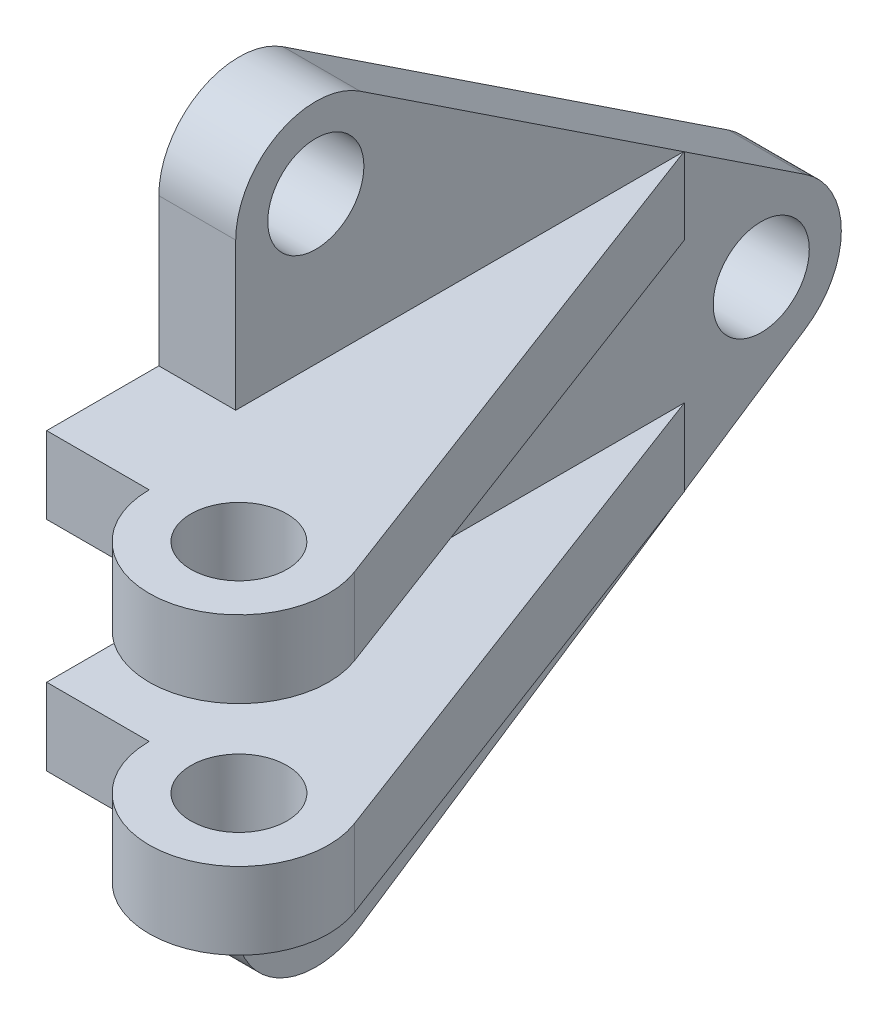
ISO-10303-21;
HEADER;
FILE_DESCRIPTION(('STEP AP214'),'2;1');
FILE_NAME('part.step','',(''),(''),'','','');
FILE_SCHEMA(('AUTOMOTIVE_DESIGN { 1 0 10303 214 1 1 1 1 }'));
ENDSEC;
DATA;
#1=APPLICATION_CONTEXT('core data for automotive mechanical design processes');
#2=APPLICATION_PROTOCOL_DEFINITION('international standard','automotive_design',2000,#1);
#3=PRODUCT_CONTEXT('',#1,'mechanical');
#4=PRODUCT('Part','Part','',(#3));
#5=PRODUCT_RELATED_PRODUCT_CATEGORY('part','',(#4));
#6=PRODUCT_DEFINITION_FORMATION('','',#4);
#7=PRODUCT_DEFINITION_CONTEXT('part definition',#1,'design');
#8=PRODUCT_DEFINITION('design','',#6,#7);
#9=PRODUCT_DEFINITION_SHAPE('','',#8);
#10=(LENGTH_UNIT() NAMED_UNIT(*) SI_UNIT(.MILLI.,.METRE.));
#11=(NAMED_UNIT(*) PLANE_ANGLE_UNIT() SI_UNIT($,.RADIAN.));
#12=(NAMED_UNIT(*) SI_UNIT($,.STERADIAN.) SOLID_ANGLE_UNIT());
#13=UNCERTAINTY_MEASURE_WITH_UNIT(LENGTH_MEASURE(1.E-05),#10,'distance_accuracy_value','');
#14=(GEOMETRIC_REPRESENTATION_CONTEXT(3) GLOBAL_UNCERTAINTY_ASSIGNED_CONTEXT((#13)) GLOBAL_UNIT_ASSIGNED_CONTEXT((#10,
#11,#12)) REPRESENTATION_CONTEXT('',''));
#15=CARTESIAN_POINT('',(0.,0.,0.));
#16=DIRECTION('',(0.,0.,1.));
#17=DIRECTION('',(1.,0.,0.));
#18=AXIS2_PLACEMENT_3D('',#15,#16,#17);
#19=CARTESIAN_POINT('',(31.1013171350298,-23.,94.564871903651));
#20=DIRECTION('',(0.935808366787846,0.,-0.352509149739214));
#21=DIRECTION('',(-0.352509149739214,0.,-0.935808366787846));
#22=AXIS2_PLACEMENT_3D('',#19,#20,#21);
#23=PLANE('',#22);
#24=DIRECTION('',(0.,-1.,0.));
#25=VECTOR('',#24,1.);
#26=CARTESIAN_POINT('',(0.,-46.,12.));
#27=LINE('',#26,#25);
#28=CARTESIAN_POINT('',(0.,-11.,12.));
#29=VERTEX_POINT('',#28);
#30=CARTESIAN_POINT('',(0.,-22.9324039501064,12.));
#31=VERTEX_POINT('',#30);
#32=EDGE_CURVE('E205',#29,#31,#27,.T.);
#33=ORIENTED_EDGE('',*,*,#32,.F.);
#34=DIRECTION('',(-0.352509149739214,0.,-0.935808366787846));
#35=VECTOR('',#34,1.);
#36=CARTESIAN_POINT('',(31.1013171350298,-11.,94.564871903651));
#37=LINE('',#36,#35);
#38=CARTESIAN_POINT('',(31.1013171350299,-11.,94.564871903651));
#39=VERTEX_POINT('',#38);
#40=EDGE_CURVE('E394',#39,#29,#37,.T.);
#41=ORIENTED_EDGE('',*,*,#40,.F.);
#42=DIRECTION('',(0.,1.,0.));
#43=VECTOR('',#42,1.);
#44=CARTESIAN_POINT('',(31.1013171350299,-23.,94.564871903651));
#45=LINE('',#44,#43);
#46=CARTESIAN_POINT('',(31.1013171350299,-23.,94.564871903651));
#47=VERTEX_POINT('',#46);
#48=EDGE_CURVE('E402',#47,#39,#45,.T.);
#49=ORIENTED_EDGE('',*,*,#48,.F.);
#50=DIRECTION('',(-0.352509149739214,0.,-0.935808366787846));
#51=VECTOR('',#50,1.);
#52=CARTESIAN_POINT('',(31.1013171350298,-23.,94.564871903651));
#53=LINE('',#52,#51);
#54=CARTESIAN_POINT('',(0.,-23.,12.));
#55=VERTEX_POINT('',#54);
#56=EDGE_CURVE('E363',#47,#55,#53,.T.);
#57=ORIENTED_EDGE('',*,*,#56,.T.);
#58=DIRECTION('',(0.,1.,0.));
#59=VECTOR('',#58,1.);
#60=CARTESIAN_POINT('',(0.,-23.,12.));
#61=LINE('',#60,#59);
#62=EDGE_CURVE('E362',#55,#31,#61,.T.);
#63=ORIENTED_EDGE('',*,*,#62,.T.);
#64=EDGE_LOOP('',(#33,#41,#49,#57,#63));
#65=FACE_BOUND('',#64,.T.);
#66=ADVANCED_FACE('F39',(#65),#23,.T.);
#67=CARTESIAN_POINT('',(18.,-23.,99.5));
#68=DIRECTION('',(0.,1.,0.));
#69=DIRECTION('',(0.,0.,1.));
#70=AXIS2_PLACEMENT_3D('',#67,#68,#69);
#71=CYLINDRICAL_SURFACE('',#70,14.);
#72=DIRECTION('',(0.,1.,0.));
#73=VECTOR('',#72,1.);
#74=CARTESIAN_POINT('',(4.,-23.,99.5));
#75=LINE('',#74,#73);
#76=CARTESIAN_POINT('',(4.,11.,99.5));
#77=VERTEX_POINT('',#76);
#78=CARTESIAN_POINT('',(4.,23.,99.5));
#79=VERTEX_POINT('',#78);
#80=EDGE_CURVE('E410',#77,#79,#75,.T.);
#81=ORIENTED_EDGE('',*,*,#80,.F.);
#82=CARTESIAN_POINT('',(18.,11.,99.5));
#83=DIRECTION('',(0.,1.,0.));
#84=DIRECTION('',(0.,0.,1.));
#85=AXIS2_PLACEMENT_3D('',#82,#83,#84);
#86=CIRCLE('',#85,14.);
#87=CARTESIAN_POINT('',(31.1013171350299,11.,94.564871903651));
#88=VERTEX_POINT('',#87);
#89=EDGE_CURVE('E187',#88,#77,#86,.F.);
#90=ORIENTED_EDGE('',*,*,#89,.F.);
#91=CARTESIAN_POINT('',(31.1013171350299,23.,94.564871903651));
#92=VERTEX_POINT('',#91);
#93=EDGE_CURVE('E183',#88,#92,#45,.T.);
#94=ORIENTED_EDGE('',*,*,#93,.T.);
#95=CARTESIAN_POINT('',(18.,23.,99.5));
#96=DIRECTION('',(0.,1.,0.));
#97=DIRECTION('',(0.,0.,1.));
#98=AXIS2_PLACEMENT_3D('',#95,#96,#97);
#99=CIRCLE('',#98,14.);
#100=EDGE_CURVE('E456',#79,#92,#99,.T.);
#101=ORIENTED_EDGE('',*,*,#100,.F.);
#102=EDGE_LOOP('',(#81,#90,#94,#101));
#103=FACE_BOUND('',#102,.T.);
#104=ADVANCED_FACE('F232',(#103),#71,.T.);
#105=CARTESIAN_POINT('',(18.,-23.,99.5));
#106=DIRECTION('',(0.,1.,0.));
#107=DIRECTION('',(0.,0.,1.));
#108=AXIS2_PLACEMENT_3D('',#105,#106,#107);
#109=CYLINDRICAL_SURFACE('',#108,7.5);
#110=CARTESIAN_POINT('',(18.,23.,99.5));
#111=DIRECTION('',(0.,1.,0.));
#112=DIRECTION('',(0.,0.,1.));
#113=AXIS2_PLACEMENT_3D('',#110,#111,#112);
#114=CIRCLE('',#113,7.5);
#115=CARTESIAN_POINT('',(18.,23.,107.));
#116=VERTEX_POINT('',#115);
#117=EDGE_CURVE('E186',#116,#116,#114,.T.);
#118=ORIENTED_EDGE('',*,*,#117,.T.);
#119=EDGE_LOOP('',(#118));
#120=FACE_BOUND('',#119,.T.);
#121=CARTESIAN_POINT('',(18.,11.,99.5));
#122=DIRECTION('',(0.,1.,0.));
#123=DIRECTION('',(0.,0.,1.));
#124=AXIS2_PLACEMENT_3D('',#121,#122,#123);
#125=CIRCLE('',#124,7.5);
#126=CARTESIAN_POINT('',(18.,11.,107.));
#127=VERTEX_POINT('',#126);
#128=EDGE_CURVE('E47',#127,#127,#125,.F.);
#129=ORIENTED_EDGE('',*,*,#128,.T.);
#130=EDGE_LOOP('',(#129));
#131=FACE_BOUND('',#130,.T.);
#132=ADVANCED_FACE('F215',(#120,#131),#109,.F.);
#133=CARTESIAN_POINT('',(-12.,-23.,99.5));
#134=DIRECTION('',(0.,0.,1.));
#135=DIRECTION('',(1.,0.,0.));
#136=AXIS2_PLACEMENT_3D('',#133,#134,#135);
#137=PLANE('',#136);
#138=DIRECTION('',(-1.,0.,0.));
#139=VECTOR('',#138,1.);
#140=CARTESIAN_POINT('',(-12.,11.,99.5));
#141=LINE('',#140,#139);
#142=CARTESIAN_POINT('',(-12.,11.,99.5));
#143=VERTEX_POINT('',#142);
#144=EDGE_CURVE('E483',#77,#143,#141,.T.);
#145=ORIENTED_EDGE('',*,*,#144,.F.);
#146=ORIENTED_EDGE('',*,*,#80,.T.);
#147=DIRECTION('',(1.,0.,0.));
#148=VECTOR('',#147,1.);
#149=CARTESIAN_POINT('',(-12.,23.,99.5));
#150=LINE('',#149,#148);
#151=CARTESIAN_POINT('',(-12.,23.,99.5));
#152=VERTEX_POINT('',#151);
#153=EDGE_CURVE('E461',#152,#79,#150,.T.);
#154=ORIENTED_EDGE('',*,*,#153,.F.);
#155=DIRECTION('',(0.,1.,0.));
#156=VECTOR('',#155,1.);
#157=CARTESIAN_POINT('',(-12.,-23.,99.5));
#158=LINE('',#157,#156);
#159=EDGE_CURVE('E298',#143,#152,#158,.T.);
#160=ORIENTED_EDGE('',*,*,#159,.F.);
#161=EDGE_LOOP('',(#145,#146,#154,#160));
#162=FACE_BOUND('',#161,.T.);
#163=ADVANCED_FACE('F272',(#162),#137,.T.);
#164=CARTESIAN_POINT('',(-12.,-46.,82.));
#165=DIRECTION('',(0.,0.,1.));
#166=DIRECTION('',(1.,0.,0.));
#167=AXIS2_PLACEMENT_3D('',#164,#165,#166);
#168=PLANE('',#167);
#169=DIRECTION('',(0.,-1.,0.));
#170=VECTOR('',#169,1.);
#171=CARTESIAN_POINT('',(0.,-46.,82.));
#172=LINE('',#171,#170);
#173=CARTESIAN_POINT('',(0.,-23.,82.));
#174=VERTEX_POINT('',#173);
#175=CARTESIAN_POINT('',(0.,-46.,82.));
#176=VERTEX_POINT('',#175);
#177=EDGE_CURVE('E297',#174,#176,#172,.T.);
#178=ORIENTED_EDGE('',*,*,#177,.F.);
#179=DIRECTION('',(-1.,0.,0.));
#180=VECTOR('',#179,1.);
#181=CARTESIAN_POINT('',(-12.,-23.,82.));
#182=LINE('',#181,#180);
#183=CARTESIAN_POINT('',(-12.,-23.,82.));
#184=VERTEX_POINT('',#183);
#185=EDGE_CURVE('E281',#174,#184,#182,.T.);
#186=ORIENTED_EDGE('',*,*,#185,.T.);
#187=DIRECTION('',(0.,-1.,0.));
#188=VECTOR('',#187,1.);
#189=CARTESIAN_POINT('',(-12.,-46.,82.));
#190=LINE('',#189,#188);
#191=CARTESIAN_POINT('',(-12.,-46.,82.));
#192=VERTEX_POINT('',#191);
#193=EDGE_CURVE('E295',#184,#192,#190,.T.);
#194=ORIENTED_EDGE('',*,*,#193,.T.);
#195=DIRECTION('',(1.,0.,0.));
#196=VECTOR('',#195,1.);
#197=CARTESIAN_POINT('',(-12.,-46.,82.));
#198=LINE('',#197,#196);
#199=EDGE_CURVE('E338',#192,#176,#198,.T.);
#200=ORIENTED_EDGE('',*,*,#199,.T.);
#201=EDGE_LOOP('',(#178,#186,#194,#200));
#202=FACE_BOUND('',#201,.T.);
#203=ADVANCED_FACE('F293',(#202),#168,.T.);
#204=CARTESIAN_POINT('',(0.,-46.,69.5));
#205=DIRECTION('',(-1.,0.,0.));
#206=DIRECTION('',(0.,0.,1.));
#207=AXIS2_PLACEMENT_3D('',#204,#205,#206);
#208=PLANE('',#207);
#209=CARTESIAN_POINT('',(0.,-46.,69.5));
#210=DIRECTION('',(1.,0.,0.));
#211=DIRECTION('',(0.,0.,1.));
#212=AXIS2_PLACEMENT_3D('',#209,#210,#211);
#213=CIRCLE('',#212,7.5);
#214=CARTESIAN_POINT('',(0.,-46.,77.));
#215=VERTEX_POINT('',#214);
#216=EDGE_CURVE('E396',#215,#215,#213,.T.);
#217=ORIENTED_EDGE('',*,*,#216,.F.);
#218=EDGE_LOOP('',(#217));
#219=FACE_BOUND('',#218,.T.);
#220=DIRECTION('',(0.,0.,-1.));
#221=VECTOR('',#220,1.);
#222=CARTESIAN_POINT('',(0.,-23.,69.5));
#223=LINE('',#222,#221);
#224=CARTESIAN_POINT('',(0.,-23.,12.1021288145132));
#225=VERTEX_POINT('',#224);
#226=EDGE_CURVE('E209',#174,#225,#223,.T.);
#227=ORIENTED_EDGE('',*,*,#226,.F.);
#228=ORIENTED_EDGE('',*,*,#177,.T.);
#229=CARTESIAN_POINT('',(0.,-46.,69.5));
#230=DIRECTION('',(1.,0.,0.));
#231=DIRECTION('',(0.,0.,1.));
#232=AXIS2_PLACEMENT_3D('',#229,#230,#231);
#233=CIRCLE('',#232,12.5);
#234=CARTESIAN_POINT('',(0.,-56.4236450142165,62.6008968251229));
#235=VERTEX_POINT('',#234);
#236=EDGE_CURVE('E318',#176,#235,#233,.T.);
#237=ORIENTED_EDGE('',*,*,#236,.T.);
#238=DIRECTION('',(0.,0.551928253990169,-0.83389160113732));
#239=VECTOR('',#238,1.);
#240=CARTESIAN_POINT('',(0.,-56.4236450142165,62.6008968251229));
#241=LINE('',#240,#239);
#242=EDGE_CURVE('E323',#235,#225,#241,.T.);
#243=ORIENTED_EDGE('',*,*,#242,.T.);
#244=EDGE_LOOP('',(#227,#228,#237,#243));
#245=FACE_BOUND('',#244,.T.);
#246=ADVANCED_FACE('F369',(#219,#245),#208,.F.);
#247=CARTESIAN_POINT('',(0.,22.9324039501064,12.));
#248=VERTEX_POINT('',#247);
#249=CARTESIAN_POINT('',(0.,11.,11.9999999999999));
#250=VERTEX_POINT('',#249);
#251=EDGE_CURVE('E180',#248,#250,#27,.T.);
#252=ORIENTED_EDGE('',*,*,#251,.T.);
#253=DIRECTION('',(0.,0.,1.));
#254=VECTOR('',#253,1.);
#255=CARTESIAN_POINT('',(0.,11.,-12.5));
#256=LINE('',#255,#254);
#257=CARTESIAN_POINT('',(0.,11.,82.));
#258=VERTEX_POINT('',#257);
#259=EDGE_CURVE('E190',#250,#258,#256,.T.);
#260=ORIENTED_EDGE('',*,*,#259,.T.);
#261=DIRECTION('',(0.,-1.,0.));
#262=VECTOR('',#261,1.);
#263=CARTESIAN_POINT('',(0.,-46.,82.));
#264=LINE('',#263,#262);
#265=CARTESIAN_POINT('',(0.,-11.,82.));
#266=VERTEX_POINT('',#265);
#267=EDGE_CURVE('E11',#258,#266,#264,.T.);
#268=ORIENTED_EDGE('',*,*,#267,.T.);
#269=DIRECTION('',(0.,0.,1.));
#270=VECTOR('',#269,1.);
#271=CARTESIAN_POINT('',(0.,-11.,-12.5));
#272=LINE('',#271,#270);
#273=EDGE_CURVE('E197',#29,#266,#272,.T.);
#274=ORIENTED_EDGE('',*,*,#273,.F.);
#275=ORIENTED_EDGE('',*,*,#32,.T.);
#276=CARTESIAN_POINT('',(0.,-10.4236450142165,-6.89910317487711));
#277=VERTEX_POINT('',#276);
#278=EDGE_CURVE('E321',#31,#277,#241,.T.);
#279=ORIENTED_EDGE('',*,*,#278,.T.);
#280=CARTESIAN_POINT('',(0.,0.,0.));
#281=DIRECTION('',(1.,0.,0.));
#282=DIRECTION('',(0.,0.,-1.));
#283=AXIS2_PLACEMENT_3D('',#280,#281,#282);
#284=CIRCLE('',#283,12.5);
#285=CARTESIAN_POINT('',(0.,10.4236450142165,-6.89910317487711));
#286=VERTEX_POINT('',#285);
#287=EDGE_CURVE('E326',#277,#286,#284,.T.);
#288=ORIENTED_EDGE('',*,*,#287,.T.);
#289=DIRECTION('',(0.,0.551928253990169,0.83389160113732));
#290=VECTOR('',#289,1.);
#291=CARTESIAN_POINT('',(0.,56.4236450142165,62.6008968251229));
#292=LINE('',#291,#290);
#293=EDGE_CURVE('E202',#286,#248,#292,.T.);
#294=ORIENTED_EDGE('',*,*,#293,.T.);
#295=EDGE_LOOP('',(#252,#260,#268,#274,#275,#279,#288,#294));
#296=FACE_BOUND('',#295,.T.);
#297=CARTESIAN_POINT('',(0.,0.,0.));
#298=DIRECTION('',(1.,0.,0.));
#299=DIRECTION('',(0.,0.,-1.));
#300=AXIS2_PLACEMENT_3D('',#297,#298,#299);
#301=CIRCLE('',#300,7.5);
#302=CARTESIAN_POINT('',(0.,0.,-7.5));
#303=VERTEX_POINT('',#302);
#304=EDGE_CURVE('E419',#303,#303,#301,.T.);
#305=ORIENTED_EDGE('',*,*,#304,.F.);
#306=EDGE_LOOP('',(#305));
#307=FACE_BOUND('',#306,.T.);
#308=ADVANCED_FACE('F199',(#296,#307),#208,.F.);
#309=CARTESIAN_POINT('',(-12.,-46.,69.5));
#310=DIRECTION('',(1.,0.,0.));
#311=DIRECTION('',(0.,0.,-1.));
#312=AXIS2_PLACEMENT_3D('',#309,#310,#311);
#313=CYLINDRICAL_SURFACE('',#312,12.5);
#314=ORIENTED_EDGE('',*,*,#236,.F.);
#315=ORIENTED_EDGE('',*,*,#199,.F.);
#316=CARTESIAN_POINT('',(-12.,-46.,69.5));
#317=DIRECTION('',(1.,0.,0.));
#318=DIRECTION('',(0.,0.,1.));
#319=AXIS2_PLACEMENT_3D('',#316,#317,#318);
#320=CIRCLE('',#319,12.5);
#321=CARTESIAN_POINT('',(-12.,-56.4236450142165,62.6008968251229));
#322=VERTEX_POINT('',#321);
#323=EDGE_CURVE('E307',#192,#322,#320,.T.);
#324=ORIENTED_EDGE('',*,*,#323,.T.);
#325=DIRECTION('',(1.,0.,0.));
#326=VECTOR('',#325,1.);
#327=CARTESIAN_POINT('',(-12.,-56.4236450142165,62.6008968251229));
#328=LINE('',#327,#326);
#329=EDGE_CURVE('E312',#322,#235,#328,.T.);
#330=ORIENTED_EDGE('',*,*,#329,.T.);
#331=EDGE_LOOP('',(#314,#315,#324,#330));
#332=FACE_BOUND('',#331,.T.);
#333=ADVANCED_FACE('F41',(#332),#313,.T.);
#334=DIRECTION('',(-1.,0.,0.));
#335=VECTOR('',#334,1.);
#336=CARTESIAN_POINT('',(-12.,23.,82.));
#337=LINE('',#336,#335);
#338=CARTESIAN_POINT('',(0.,23.,82.));
#339=VERTEX_POINT('',#338);
#340=CARTESIAN_POINT('',(-12.,23.,82.));
#341=VERTEX_POINT('',#340);
#342=EDGE_CURVE('E289',#339,#341,#337,.T.);
#343=ORIENTED_EDGE('',*,*,#342,.F.);
#344=CARTESIAN_POINT('',(0.,46.,82.));
#345=VERTEX_POINT('',#344);
#346=EDGE_CURVE('E335',#345,#339,#172,.T.);
#347=ORIENTED_EDGE('',*,*,#346,.F.);
#348=DIRECTION('',(1.,0.,0.));
#349=VECTOR('',#348,1.);
#350=CARTESIAN_POINT('',(-12.,46.,82.));
#351=LINE('',#350,#349);
#352=CARTESIAN_POINT('',(-12.,46.,82.));
#353=VERTEX_POINT('',#352);
#354=EDGE_CURVE('E341',#353,#345,#351,.T.);
#355=ORIENTED_EDGE('',*,*,#354,.F.);
#356=EDGE_CURVE('E308',#353,#341,#190,.T.);
#357=ORIENTED_EDGE('',*,*,#356,.T.);
#358=EDGE_LOOP('',(#343,#347,#355,#357));
#359=FACE_BOUND('',#358,.T.);
#360=ADVANCED_FACE('F434',(#359),#168,.T.);
#361=CARTESIAN_POINT('',(-12.,46.,69.5));
#362=DIRECTION('',(1.,0.,0.));
#363=DIRECTION('',(0.,0.,-1.));
#364=AXIS2_PLACEMENT_3D('',#361,#362,#363);
#365=CYLINDRICAL_SURFACE('',#364,12.5);
#366=CARTESIAN_POINT('',(0.,46.,69.5));
#367=DIRECTION('',(1.,0.,0.));
#368=DIRECTION('',(0.,0.,-1.));
#369=AXIS2_PLACEMENT_3D('',#366,#367,#368);
#370=CIRCLE('',#369,12.5);
#371=CARTESIAN_POINT('',(0.,56.4236450142165,62.6008968251229));
#372=VERTEX_POINT('',#371);
#373=EDGE_CURVE('E331',#372,#345,#370,.T.);
#374=ORIENTED_EDGE('',*,*,#373,.F.);
#375=DIRECTION('',(1.,0.,0.));
#376=VECTOR('',#375,1.);
#377=CARTESIAN_POINT('',(-12.,56.4236450142165,62.6008968251229));
#378=LINE('',#377,#376);
#379=CARTESIAN_POINT('',(-12.,56.4236450142165,62.6008968251229));
#380=VERTEX_POINT('',#379);
#381=EDGE_CURVE('E343',#380,#372,#378,.T.);
#382=ORIENTED_EDGE('',*,*,#381,.F.);
#383=CARTESIAN_POINT('',(-12.,46.,69.5));
#384=DIRECTION('',(1.,0.,0.));
#385=DIRECTION('',(0.,0.,-1.));
#386=AXIS2_PLACEMENT_3D('',#383,#384,#385);
#387=CIRCLE('',#386,12.5);
#388=EDGE_CURVE('E309',#380,#353,#387,.T.);
#389=ORIENTED_EDGE('',*,*,#388,.T.);
#390=ORIENTED_EDGE('',*,*,#354,.T.);
#391=EDGE_LOOP('',(#374,#382,#389,#390));
#392=FACE_BOUND('',#391,.T.);
#393=ADVANCED_FACE('F545',(#392),#365,.T.);
#394=CARTESIAN_POINT('',(-12.,56.4236450142165,62.6008968251229));
#395=DIRECTION('',(0.,0.83389160113732,-0.551928253990169));
#396=DIRECTION('',(0.,0.551928253990169,0.83389160113732));
#397=AXIS2_PLACEMENT_3D('',#394,#395,#396);
#398=PLANE('',#397);
#399=ORIENTED_EDGE('',*,*,#293,.F.);
#400=DIRECTION('',(1.,0.,0.));
#401=VECTOR('',#400,1.);
#402=CARTESIAN_POINT('',(-12.,10.4236450142165,-6.89910317487711));
#403=LINE('',#402,#401);
#404=CARTESIAN_POINT('',(-12.,10.4236450142165,-6.89910317487711));
#405=VERTEX_POINT('',#404);
#406=EDGE_CURVE('E346',#405,#286,#403,.T.);
#407=ORIENTED_EDGE('',*,*,#406,.F.);
#408=DIRECTION('',(0.,0.551928253990169,0.83389160113732));
#409=VECTOR('',#408,1.);
#410=CARTESIAN_POINT('',(-12.,56.4236450142165,62.6008968251229));
#411=LINE('',#410,#409);
#412=EDGE_CURVE('E314',#405,#380,#411,.T.);
#413=ORIENTED_EDGE('',*,*,#412,.T.);
#414=ORIENTED_EDGE('',*,*,#381,.T.);
#415=CARTESIAN_POINT('',(0.,23.,12.1021288145132));
#416=VERTEX_POINT('',#415);
#417=EDGE_CURVE('E329',#416,#372,#292,.T.);
#418=ORIENTED_EDGE('',*,*,#417,.F.);
#419=EDGE_CURVE('E332',#248,#416,#292,.T.);
#420=ORIENTED_EDGE('',*,*,#419,.F.);
#421=EDGE_LOOP('',(#399,#407,#413,#414,#418,#420));
#422=FACE_BOUND('',#421,.T.);
#423=ADVANCED_FACE('F384',(#422),#398,.T.);
#424=CARTESIAN_POINT('',(-12.,0.,0.));
#425=DIRECTION('',(1.,0.,0.));
#426=DIRECTION('',(0.,0.,-1.));
#427=AXIS2_PLACEMENT_3D('',#424,#425,#426);
#428=CYLINDRICAL_SURFACE('',#427,12.5);
#429=ORIENTED_EDGE('',*,*,#287,.F.);
#430=DIRECTION('',(1.,0.,0.));
#431=VECTOR('',#430,1.);
#432=CARTESIAN_POINT('',(-12.,-10.4236450142165,-6.89910317487711));
#433=LINE('',#432,#431);
#434=CARTESIAN_POINT('',(-12.,-10.4236450142165,-6.89910317487711));
#435=VERTEX_POINT('',#434);
#436=EDGE_CURVE('E349',#435,#277,#433,.T.);
#437=ORIENTED_EDGE('',*,*,#436,.F.);
#438=CARTESIAN_POINT('',(-12.,0.,0.));
#439=DIRECTION('',(1.,0.,0.));
#440=DIRECTION('',(0.,0.,-1.));
#441=AXIS2_PLACEMENT_3D('',#438,#439,#440);
#442=CIRCLE('',#441,12.5);
#443=EDGE_CURVE('E377',#435,#405,#442,.T.);
#444=ORIENTED_EDGE('',*,*,#443,.T.);
#445=ORIENTED_EDGE('',*,*,#406,.T.);
#446=EDGE_LOOP('',(#429,#437,#444,#445));
#447=FACE_BOUND('',#446,.T.);
#448=ADVANCED_FACE('F390',(#447),#428,.T.);
#449=CARTESIAN_POINT('',(-12.,-56.4236450142165,62.6008968251229));
#450=DIRECTION('',(0.,-0.83389160113732,-0.551928253990169));
#451=DIRECTION('',(0.,0.551928253990169,-0.83389160113732));
#452=AXIS2_PLACEMENT_3D('',#449,#450,#451);
#453=PLANE('',#452);
#454=ORIENTED_EDGE('',*,*,#242,.F.);
#455=ORIENTED_EDGE('',*,*,#329,.F.);
#456=DIRECTION('',(0.,0.551928253990169,-0.83389160113732));
#457=VECTOR('',#456,1.);
#458=CARTESIAN_POINT('',(-12.,-56.4236450142165,62.6008968251229));
#459=LINE('',#458,#457);
#460=EDGE_CURVE('E373',#322,#435,#459,.T.);
#461=ORIENTED_EDGE('',*,*,#460,.T.);
#462=ORIENTED_EDGE('',*,*,#436,.T.);
#463=ORIENTED_EDGE('',*,*,#278,.F.);
#464=EDGE_CURVE('E327',#225,#31,#241,.T.);
#465=ORIENTED_EDGE('',*,*,#464,.F.);
#466=EDGE_LOOP('',(#454,#455,#461,#462,#463,#465));
#467=FACE_BOUND('',#466,.T.);
#468=ADVANCED_FACE('F368',(#467),#453,.T.);
#469=CARTESIAN_POINT('',(-12.,-46.,69.5));
#470=DIRECTION('',(-1.,0.,0.));
#471=DIRECTION('',(0.,0.,1.));
#472=AXIS2_PLACEMENT_3D('',#469,#470,#471);
#473=PLANE('',#472);
#474=DIRECTION('',(0.,0.,1.));
#475=VECTOR('',#474,1.);
#476=CARTESIAN_POINT('',(-12.,11.,32.8065044950046));
#477=LINE('',#476,#475);
#478=CARTESIAN_POINT('',(-12.,11.,82.));
#479=VERTEX_POINT('',#478);
#480=EDGE_CURVE('E482',#479,#143,#477,.T.);
#481=ORIENTED_EDGE('',*,*,#480,.T.);
#482=ORIENTED_EDGE('',*,*,#159,.T.);
#483=DIRECTION('',(0.,0.,1.));
#484=VECTOR('',#483,1.);
#485=CARTESIAN_POINT('',(-12.,23.,99.5));
#486=LINE('',#485,#484);
#487=EDGE_CURVE('E464',#341,#152,#486,.T.);
#488=ORIENTED_EDGE('',*,*,#487,.F.);
#489=ORIENTED_EDGE('',*,*,#356,.F.);
#490=ORIENTED_EDGE('',*,*,#388,.F.);
#491=ORIENTED_EDGE('',*,*,#412,.F.);
#492=ORIENTED_EDGE('',*,*,#443,.F.);
#493=ORIENTED_EDGE('',*,*,#460,.F.);
#494=ORIENTED_EDGE('',*,*,#323,.F.);
#495=ORIENTED_EDGE('',*,*,#193,.F.);
#496=DIRECTION('',(0.,0.,1.));
#497=VECTOR('',#496,1.);
#498=CARTESIAN_POINT('',(-12.,-23.,99.5));
#499=LINE('',#498,#497);
#500=CARTESIAN_POINT('',(-12.,-23.,99.5));
#501=VERTEX_POINT('',#500);
#502=EDGE_CURVE('E279',#184,#501,#499,.T.);
#503=ORIENTED_EDGE('',*,*,#502,.T.);
#504=CARTESIAN_POINT('',(-12.,-11.,99.5));
#505=VERTEX_POINT('',#504);
#506=EDGE_CURVE('E411',#501,#505,#158,.T.);
#507=ORIENTED_EDGE('',*,*,#506,.T.);
#508=DIRECTION('',(0.,0.,1.));
#509=VECTOR('',#508,1.);
#510=CARTESIAN_POINT('',(-12.,-11.,32.8065044950046));
#511=LINE('',#510,#509);
#512=CARTESIAN_POINT('',(-12.,-11.,82.));
#513=VERTEX_POINT('',#512);
#514=EDGE_CURVE('E54',#513,#505,#511,.T.);
#515=ORIENTED_EDGE('',*,*,#514,.F.);
#516=DIRECTION('',(0.,1.,0.));
#517=VECTOR('',#516,1.);
#518=CARTESIAN_POINT('',(-12.,11.,82.));
#519=LINE('',#518,#517);
#520=EDGE_CURVE('E480',#513,#479,#519,.T.);
#521=ORIENTED_EDGE('',*,*,#520,.T.);
#522=EDGE_LOOP('',(#481,#482,#488,#489,#490,#491,#492,#493,#494,#495,#503,#507,#515,#521));
#523=FACE_BOUND('',#522,.T.);
#524=CARTESIAN_POINT('',(-12.,-46.,69.5));
#525=DIRECTION('',(1.,0.,0.));
#526=DIRECTION('',(0.,0.,1.));
#527=AXIS2_PLACEMENT_3D('',#524,#525,#526);
#528=CIRCLE('',#527,7.5);
#529=CARTESIAN_POINT('',(-12.,-46.,77.));
#530=VERTEX_POINT('',#529);
#531=EDGE_CURVE('E400',#530,#530,#528,.T.);
#532=ORIENTED_EDGE('',*,*,#531,.T.);
#533=EDGE_LOOP('',(#532));
#534=FACE_BOUND('',#533,.T.);
#535=CARTESIAN_POINT('',(-12.,46.,69.5));
#536=DIRECTION('',(1.,0.,0.));
#537=DIRECTION('',(0.,0.,-1.));
#538=AXIS2_PLACEMENT_3D('',#535,#536,#537);
#539=CIRCLE('',#538,7.5);
#540=CARTESIAN_POINT('',(-12.,46.,62.));
#541=VERTEX_POINT('',#540);
#542=EDGE_CURVE('E416',#541,#541,#539,.T.);
#543=ORIENTED_EDGE('',*,*,#542,.T.);
#544=EDGE_LOOP('',(#543));
#545=FACE_BOUND('',#544,.T.);
#546=CARTESIAN_POINT('',(-12.,0.,0.));
#547=DIRECTION('',(1.,0.,0.));
#548=DIRECTION('',(0.,0.,-1.));
#549=AXIS2_PLACEMENT_3D('',#546,#547,#548);
#550=CIRCLE('',#549,7.5);
#551=CARTESIAN_POINT('',(-12.,0.,-7.5));
#552=VERTEX_POINT('',#551);
#553=EDGE_CURVE('E322',#552,#552,#550,.T.);
#554=ORIENTED_EDGE('',*,*,#553,.T.);
#555=EDGE_LOOP('',(#554));
#556=FACE_BOUND('',#555,.T.);
#557=ADVANCED_FACE('F303',(#523,#534,#545,#556),#473,.T.);
#558=CARTESIAN_POINT('',(0.,46.,69.5));
#559=DIRECTION('',(1.,0.,0.));
#560=DIRECTION('',(0.,0.,-1.));
#561=AXIS2_PLACEMENT_3D('',#558,#559,#560);
#562=CIRCLE('',#561,7.5);
#563=CARTESIAN_POINT('',(0.,46.,62.));
#564=VERTEX_POINT('',#563);
#565=EDGE_CURVE('E414',#564,#564,#562,.T.);
#566=ORIENTED_EDGE('',*,*,#565,.F.);
#567=EDGE_LOOP('',(#566));
#568=FACE_BOUND('',#567,.T.);
#569=ORIENTED_EDGE('',*,*,#346,.T.);
#570=DIRECTION('',(0.,0.,-1.));
#571=VECTOR('',#570,1.);
#572=CARTESIAN_POINT('',(0.,23.,69.5));
#573=LINE('',#572,#571);
#574=EDGE_CURVE('E340',#339,#416,#573,.T.);
#575=ORIENTED_EDGE('',*,*,#574,.T.);
#576=ORIENTED_EDGE('',*,*,#417,.T.);
#577=ORIENTED_EDGE('',*,*,#373,.T.);
#578=EDGE_LOOP('',(#569,#575,#576,#577));
#579=FACE_BOUND('',#578,.T.);
#580=ADVANCED_FACE('F429',(#568,#579),#208,.F.);
#581=CARTESIAN_POINT('',(-12.,0.,0.));
#582=DIRECTION('',(1.,0.,0.));
#583=DIRECTION('',(0.,0.,-1.));
#584=AXIS2_PLACEMENT_3D('',#581,#582,#583);
#585=CYLINDRICAL_SURFACE('',#584,7.5);
#586=ORIENTED_EDGE('',*,*,#553,.F.);
#587=EDGE_LOOP('',(#586));
#588=FACE_BOUND('',#587,.T.);
#589=ORIENTED_EDGE('',*,*,#304,.T.);
#590=EDGE_LOOP('',(#589));
#591=FACE_BOUND('',#590,.T.);
#592=ADVANCED_FACE('F426',(#588,#591),#585,.F.);
#593=CARTESIAN_POINT('',(-12.,46.,69.5));
#594=DIRECTION('',(1.,0.,0.));
#595=DIRECTION('',(0.,0.,-1.));
#596=AXIS2_PLACEMENT_3D('',#593,#594,#595);
#597=CYLINDRICAL_SURFACE('',#596,7.5);
#598=ORIENTED_EDGE('',*,*,#542,.F.);
#599=EDGE_LOOP('',(#598));
#600=FACE_BOUND('',#599,.T.);
#601=ORIENTED_EDGE('',*,*,#565,.T.);
#602=EDGE_LOOP('',(#601));
#603=FACE_BOUND('',#602,.T.);
#604=ADVANCED_FACE('F445',(#600,#603),#597,.F.);
#605=CARTESIAN_POINT('',(-12.,-46.,69.5));
#606=DIRECTION('',(1.,0.,0.));
#607=DIRECTION('',(0.,0.,-1.));
#608=AXIS2_PLACEMENT_3D('',#605,#606,#607);
#609=CYLINDRICAL_SURFACE('',#608,7.5);
#610=ORIENTED_EDGE('',*,*,#531,.F.);
#611=EDGE_LOOP('',(#610));
#612=FACE_BOUND('',#611,.T.);
#613=ORIENTED_EDGE('',*,*,#216,.T.);
#614=EDGE_LOOP('',(#613));
#615=FACE_BOUND('',#614,.T.);
#616=ADVANCED_FACE('F259',(#612,#615),#609,.F.);
#617=CARTESIAN_POINT('',(0.,-23.,82.));
#618=DIRECTION('',(-1.,0.,0.));
#619=DIRECTION('',(0.,0.,1.));
#620=AXIS2_PLACEMENT_3D('',#617,#618,#619);
#621=PLANE('',#620);
#622=CARTESIAN_POINT('',(0.,23.,12.));
#623=VERTEX_POINT('',#622);
#624=EDGE_CURVE('E397',#248,#623,#61,.T.);
#625=ORIENTED_EDGE('',*,*,#624,.F.);
#626=ORIENTED_EDGE('',*,*,#419,.T.);
#627=DIRECTION('',(0.,0.,1.));
#628=VECTOR('',#627,1.);
#629=CARTESIAN_POINT('',(0.,23.,82.));
#630=LINE('',#629,#628);
#631=EDGE_CURVE('E62',#623,#416,#630,.T.);
#632=ORIENTED_EDGE('',*,*,#631,.F.);
#633=EDGE_LOOP('',(#625,#626,#632));
#634=FACE_BOUND('',#633,.T.);
#635=ADVANCED_FACE('F253',(#634),#621,.T.);
#636=DIRECTION('',(0.,0.,1.));
#637=VECTOR('',#636,1.);
#638=CARTESIAN_POINT('',(0.,-23.,82.));
#639=LINE('',#638,#637);
#640=EDGE_CURVE('E299',#55,#225,#639,.T.);
#641=ORIENTED_EDGE('',*,*,#640,.T.);
#642=ORIENTED_EDGE('',*,*,#464,.T.);
#643=ORIENTED_EDGE('',*,*,#62,.F.);
#644=EDGE_LOOP('',(#641,#642,#643));
#645=FACE_BOUND('',#644,.T.);
#646=ADVANCED_FACE('F245',(#645),#621,.T.);
#647=DIRECTION('',(0.352509149739214,0.,0.935808366787846));
#648=VECTOR('',#647,1.);
#649=CARTESIAN_POINT('',(31.1013171350298,11.,94.564871903651));
#650=LINE('',#649,#648);
#651=EDGE_CURVE('E176',#250,#88,#650,.T.);
#652=ORIENTED_EDGE('',*,*,#651,.F.);
#653=ORIENTED_EDGE('',*,*,#251,.F.);
#654=ORIENTED_EDGE('',*,*,#624,.T.);
#655=DIRECTION('',(-0.352509149739214,0.,-0.935808366787846));
#656=VECTOR('',#655,1.);
#657=CARTESIAN_POINT('',(31.1013171350298,23.,94.564871903651));
#658=LINE('',#657,#656);
#659=EDGE_CURVE('E455',#92,#623,#658,.T.);
#660=ORIENTED_EDGE('',*,*,#659,.F.);
#661=ORIENTED_EDGE('',*,*,#93,.F.);
#662=EDGE_LOOP('',(#652,#653,#654,#660,#661));
#663=FACE_BOUND('',#662,.T.);
#664=ADVANCED_FACE('F178',(#663),#23,.T.);
#665=CARTESIAN_POINT('',(18.,-11.,99.5));
#666=DIRECTION('',(0.,-1.,0.));
#667=DIRECTION('',(0.,0.,-1.));
#668=AXIS2_PLACEMENT_3D('',#665,#666,#667);
#669=CIRCLE('',#668,14.);
#670=CARTESIAN_POINT('',(4.,-11.,99.5));
#671=VERTEX_POINT('',#670);
#672=EDGE_CURVE('E476',#671,#39,#669,.F.);
#673=ORIENTED_EDGE('',*,*,#672,.F.);
#674=CARTESIAN_POINT('',(4.,-23.,99.5));
#675=VERTEX_POINT('',#674);
#676=EDGE_CURVE('E407',#675,#671,#75,.T.);
#677=ORIENTED_EDGE('',*,*,#676,.F.);
#678=CARTESIAN_POINT('',(18.,-23.,99.5));
#679=DIRECTION('',(0.,1.,0.));
#680=DIRECTION('',(0.,0.,1.));
#681=AXIS2_PLACEMENT_3D('',#678,#679,#680);
#682=CIRCLE('',#681,14.);
#683=EDGE_CURVE('E467',#675,#47,#682,.T.);
#684=ORIENTED_EDGE('',*,*,#683,.T.);
#685=ORIENTED_EDGE('',*,*,#48,.T.);
#686=EDGE_LOOP('',(#673,#677,#684,#685));
#687=FACE_BOUND('',#686,.T.);
#688=ADVANCED_FACE('F241',(#687),#71,.T.);
#689=DIRECTION('',(1.,0.,0.));
#690=VECTOR('',#689,1.);
#691=CARTESIAN_POINT('',(-12.,-11.,99.5));
#692=LINE('',#691,#690);
#693=EDGE_CURVE('E486',#505,#671,#692,.T.);
#694=ORIENTED_EDGE('',*,*,#693,.F.);
#695=ORIENTED_EDGE('',*,*,#506,.F.);
#696=DIRECTION('',(1.,0.,0.));
#697=VECTOR('',#696,1.);
#698=CARTESIAN_POINT('',(-12.,-23.,99.5));
#699=LINE('',#698,#697);
#700=EDGE_CURVE('E285',#501,#675,#699,.T.);
#701=ORIENTED_EDGE('',*,*,#700,.T.);
#702=ORIENTED_EDGE('',*,*,#676,.T.);
#703=EDGE_LOOP('',(#694,#695,#701,#702));
#704=FACE_BOUND('',#703,.T.);
#705=ADVANCED_FACE('F250',(#704),#137,.T.);
#706=CARTESIAN_POINT('',(18.,-23.,99.5));
#707=DIRECTION('',(0.,1.,0.));
#708=DIRECTION('',(0.,0.,1.));
#709=AXIS2_PLACEMENT_3D('',#706,#707,#708);
#710=PLANE('',#709);
#711=CARTESIAN_POINT('',(18.,-23.,99.5));
#712=DIRECTION('',(0.,1.,0.));
#713=DIRECTION('',(0.,0.,1.));
#714=AXIS2_PLACEMENT_3D('',#711,#712,#713);
#715=CIRCLE('',#714,7.5);
#716=CARTESIAN_POINT('',(18.,-23.,107.));
#717=VERTEX_POINT('',#716);
#718=EDGE_CURVE('E276',#717,#717,#715,.T.);
#719=ORIENTED_EDGE('',*,*,#718,.T.);
#720=EDGE_LOOP('',(#719));
#721=FACE_BOUND('',#720,.T.);
#722=ORIENTED_EDGE('',*,*,#502,.F.);
#723=ORIENTED_EDGE('',*,*,#185,.F.);
#724=ORIENTED_EDGE('',*,*,#226,.T.);
#725=ORIENTED_EDGE('',*,*,#640,.F.);
#726=ORIENTED_EDGE('',*,*,#56,.F.);
#727=ORIENTED_EDGE('',*,*,#683,.F.);
#728=ORIENTED_EDGE('',*,*,#700,.F.);
#729=EDGE_LOOP('',(#722,#723,#724,#725,#726,#727,#728));
#730=FACE_BOUND('',#729,.T.);
#731=ADVANCED_FACE('F265',(#721,#730),#710,.F.);
#732=CARTESIAN_POINT('',(18.,23.,99.5));
#733=DIRECTION('',(0.,1.,0.));
#734=DIRECTION('',(0.,0.,1.));
#735=AXIS2_PLACEMENT_3D('',#732,#733,#734);
#736=PLANE('',#735);
#737=ORIENTED_EDGE('',*,*,#117,.F.);
#738=EDGE_LOOP('',(#737));
#739=FACE_BOUND('',#738,.T.);
#740=ORIENTED_EDGE('',*,*,#487,.T.);
#741=ORIENTED_EDGE('',*,*,#153,.T.);
#742=ORIENTED_EDGE('',*,*,#100,.T.);
#743=ORIENTED_EDGE('',*,*,#659,.T.);
#744=ORIENTED_EDGE('',*,*,#631,.T.);
#745=ORIENTED_EDGE('',*,*,#574,.F.);
#746=ORIENTED_EDGE('',*,*,#342,.T.);
#747=EDGE_LOOP('',(#740,#741,#742,#743,#744,#745,#746));
#748=FACE_BOUND('',#747,.T.);
#749=ADVANCED_FACE('F227',(#739,#748),#736,.T.);
#750=CARTESIAN_POINT('',(18.,-11.,99.5));
#751=DIRECTION('',(0.,-1.,0.));
#752=DIRECTION('',(0.,0.,-1.));
#753=AXIS2_PLACEMENT_3D('',#750,#751,#752);
#754=CIRCLE('',#753,7.5);
#755=CARTESIAN_POINT('',(18.,-11.,92.));
#756=VERTEX_POINT('',#755);
#757=EDGE_CURVE('E204',#756,#756,#754,.F.);
#758=ORIENTED_EDGE('',*,*,#757,.T.);
#759=EDGE_LOOP('',(#758));
#760=FACE_BOUND('',#759,.T.);
#761=ORIENTED_EDGE('',*,*,#718,.F.);
#762=EDGE_LOOP('',(#761));
#763=FACE_BOUND('',#762,.T.);
#764=ADVANCED_FACE('F218',(#760,#763),#109,.F.);
#765=CARTESIAN_POINT('',(-12.,11.,32.8065044950046));
#766=DIRECTION('',(0.,1.,0.));
#767=DIRECTION('',(0.,0.,1.));
#768=AXIS2_PLACEMENT_3D('',#765,#766,#767);
#769=PLANE('',#768);
#770=ORIENTED_EDGE('',*,*,#89,.T.);
#771=ORIENTED_EDGE('',*,*,#144,.T.);
#772=ORIENTED_EDGE('',*,*,#480,.F.);
#773=DIRECTION('',(1.,0.,0.));
#774=VECTOR('',#773,1.);
#775=CARTESIAN_POINT('',(-12.,11.,82.));
#776=LINE('',#775,#774);
#777=EDGE_CURVE('E194',#479,#258,#776,.T.);
#778=ORIENTED_EDGE('',*,*,#777,.T.);
#779=ORIENTED_EDGE('',*,*,#259,.F.);
#780=ORIENTED_EDGE('',*,*,#651,.T.);
#781=EDGE_LOOP('',(#770,#771,#772,#778,#779,#780));
#782=FACE_BOUND('',#781,.T.);
#783=ORIENTED_EDGE('',*,*,#128,.F.);
#784=EDGE_LOOP('',(#783));
#785=FACE_BOUND('',#784,.T.);
#786=ADVANCED_FACE('F191',(#782,#785),#769,.F.);
#787=CARTESIAN_POINT('',(-12.,-11.,32.8065044950046));
#788=DIRECTION('',(0.,-1.,0.));
#789=DIRECTION('',(0.,0.,-1.));
#790=AXIS2_PLACEMENT_3D('',#787,#788,#789);
#791=PLANE('',#790);
#792=ORIENTED_EDGE('',*,*,#693,.T.);
#793=ORIENTED_EDGE('',*,*,#672,.T.);
#794=ORIENTED_EDGE('',*,*,#40,.T.);
#795=ORIENTED_EDGE('',*,*,#273,.T.);
#796=DIRECTION('',(-1.,0.,0.));
#797=VECTOR('',#796,1.);
#798=CARTESIAN_POINT('',(-12.,-11.,82.));
#799=LINE('',#798,#797);
#800=EDGE_CURVE('E478',#266,#513,#799,.T.);
#801=ORIENTED_EDGE('',*,*,#800,.T.);
#802=ORIENTED_EDGE('',*,*,#514,.T.);
#803=EDGE_LOOP('',(#792,#793,#794,#795,#801,#802));
#804=FACE_BOUND('',#803,.T.);
#805=ORIENTED_EDGE('',*,*,#757,.F.);
#806=EDGE_LOOP('',(#805));
#807=FACE_BOUND('',#806,.T.);
#808=ADVANCED_FACE('F217',(#804,#807),#791,.F.);
#809=CARTESIAN_POINT('',(-12.,-46.,82.));
#810=DIRECTION('',(0.,0.,1.));
#811=DIRECTION('',(1.,0.,0.));
#812=AXIS2_PLACEMENT_3D('',#809,#810,#811);
#813=PLANE('',#812);
#814=ORIENTED_EDGE('',*,*,#267,.F.);
#815=ORIENTED_EDGE('',*,*,#777,.F.);
#816=ORIENTED_EDGE('',*,*,#520,.F.);
#817=ORIENTED_EDGE('',*,*,#800,.F.);
#818=EDGE_LOOP('',(#814,#815,#816,#817));
#819=FACE_BOUND('',#818,.T.);
#820=ADVANCED_FACE('F224',(#819),#813,.T.);
#821=CLOSED_SHELL('',(#66,#104,#132,#163,#203,#246,#308,#333,#360,#393,#423,#448,#468,#557,#580,
#592,#604,#616,#635,#646,#664,#688,#705,#731,#749,#764,#786,#808,#820));
#822=MANIFOLD_SOLID_BREP('B2',#821);
#823=ADVANCED_BREP_SHAPE_REPRESENTATION('',(#18,#822),#14);
#824=SHAPE_DEFINITION_REPRESENTATION(#9,#823);
ENDSEC;
END-ISO-10303-21;
